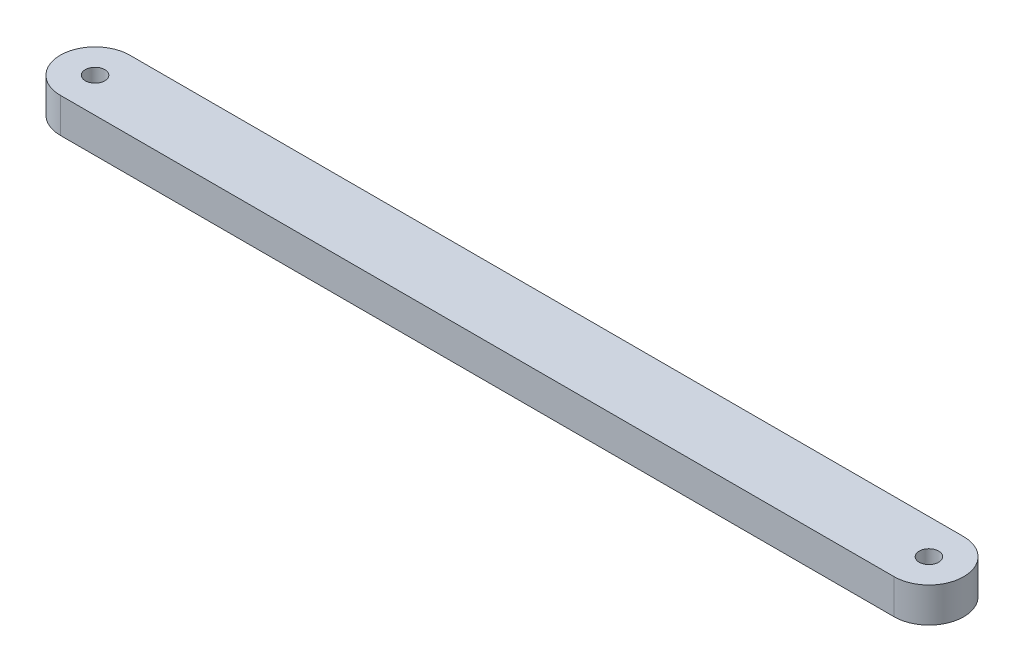
ISO-10303-21;
HEADER;
FILE_DESCRIPTION(('STEP AP214'),'2;1');
FILE_NAME('part.step','',(''),(''),'','','');
FILE_SCHEMA(('AUTOMOTIVE_DESIGN { 1 0 10303 214 1 1 1 1 }'));
ENDSEC;
DATA;
#1=APPLICATION_CONTEXT('core data for automotive mechanical design processes');
#2=APPLICATION_PROTOCOL_DEFINITION('international standard','automotive_design',2000,#1);
#3=PRODUCT_CONTEXT('',#1,'mechanical');
#4=PRODUCT('Part','Part','',(#3));
#5=PRODUCT_RELATED_PRODUCT_CATEGORY('part','',(#4));
#6=PRODUCT_DEFINITION_FORMATION('','',#4);
#7=PRODUCT_DEFINITION_CONTEXT('part definition',#1,'design');
#8=PRODUCT_DEFINITION('design','',#6,#7);
#9=PRODUCT_DEFINITION_SHAPE('','',#8);
#10=(LENGTH_UNIT() NAMED_UNIT(*) SI_UNIT(.MILLI.,.METRE.));
#11=(NAMED_UNIT(*) PLANE_ANGLE_UNIT() SI_UNIT($,.RADIAN.));
#12=(NAMED_UNIT(*) SI_UNIT($,.STERADIAN.) SOLID_ANGLE_UNIT());
#13=UNCERTAINTY_MEASURE_WITH_UNIT(LENGTH_MEASURE(1.E-05),#10,'distance_accuracy_value','');
#14=(GEOMETRIC_REPRESENTATION_CONTEXT(3) GLOBAL_UNCERTAINTY_ASSIGNED_CONTEXT((#13)) GLOBAL_UNIT_ASSIGNED_CONTEXT((#10,
#11,#12)) REPRESENTATION_CONTEXT('',''));
#15=CARTESIAN_POINT('',(0.,0.,0.));
#16=DIRECTION('',(0.,0.,1.));
#17=DIRECTION('',(1.,0.,0.));
#18=AXIS2_PLACEMENT_3D('',#15,#16,#17);
#19=CARTESIAN_POINT('',(0.,5.,0.));
#20=DIRECTION('',(0.,1.,0.));
#21=DIRECTION('',(0.,0.,1.));
#22=AXIS2_PLACEMENT_3D('',#19,#20,#21);
#23=PLANE('',#22);
#24=CARTESIAN_POINT('',(0.,5.,0.));
#25=DIRECTION('',(0.,1.,0.));
#26=DIRECTION('',(0.,0.,1.));
#27=AXIS2_PLACEMENT_3D('',#24,#25,#26);
#28=CIRCLE('',#27,1.4);
#29=CARTESIAN_POINT('',(0.,5.,1.4));
#30=VERTEX_POINT('',#29);
#31=EDGE_CURVE('E110',#30,#30,#28,.T.);
#32=ORIENTED_EDGE('',*,*,#31,.F.);
#33=EDGE_LOOP('',(#32));
#34=FACE_BOUND('',#33,.T.);
#35=CARTESIAN_POINT('',(0.,5.,0.));
#36=DIRECTION('',(0.,1.,0.));
#37=DIRECTION('',(0.,0.,1.));
#38=AXIS2_PLACEMENT_3D('',#35,#36,#37);
#39=CIRCLE('',#38,5.);
#40=CARTESIAN_POINT('',(0.,5.,-5.));
#41=VERTEX_POINT('',#40);
#42=CARTESIAN_POINT('',(0.,5.,5.));
#43=VERTEX_POINT('',#42);
#44=EDGE_CURVE('E95',#41,#43,#39,.T.);
#45=ORIENTED_EDGE('',*,*,#44,.T.);
#46=DIRECTION('',(1.,0.,0.));
#47=VECTOR('',#46,1.);
#48=CARTESIAN_POINT('',(0.,5.,5.));
#49=LINE('',#48,#47);
#50=CARTESIAN_POINT('',(120.,5.,5.));
#51=VERTEX_POINT('',#50);
#52=EDGE_CURVE('E90',#43,#51,#49,.T.);
#53=ORIENTED_EDGE('',*,*,#52,.T.);
#54=CARTESIAN_POINT('',(120.,5.,0.));
#55=DIRECTION('',(0.,1.,0.));
#56=DIRECTION('',(0.,0.,1.));
#57=AXIS2_PLACEMENT_3D('',#54,#55,#56);
#58=CIRCLE('',#57,5.);
#59=CARTESIAN_POINT('',(120.,5.,-5.));
#60=VERTEX_POINT('',#59);
#61=EDGE_CURVE('E93',#51,#60,#58,.T.);
#62=ORIENTED_EDGE('',*,*,#61,.T.);
#63=DIRECTION('',(-1.,0.,0.));
#64=VECTOR('',#63,1.);
#65=CARTESIAN_POINT('',(0.,5.,-5.));
#66=LINE('',#65,#64);
#67=EDGE_CURVE('E60',#60,#41,#66,.T.);
#68=ORIENTED_EDGE('',*,*,#67,.T.);
#69=EDGE_LOOP('',(#45,#53,#62,#68));
#70=FACE_BOUND('',#69,.T.);
#71=CARTESIAN_POINT('',(120.,5.,0.));
#72=DIRECTION('',(0.,1.,0.));
#73=DIRECTION('',(0.,0.,1.));
#74=AXIS2_PLACEMENT_3D('',#71,#72,#73);
#75=CIRCLE('',#74,1.4);
#76=CARTESIAN_POINT('',(120.,5.,1.4));
#77=VERTEX_POINT('',#76);
#78=EDGE_CURVE('E125',#77,#77,#75,.T.);
#79=ORIENTED_EDGE('',*,*,#78,.F.);
#80=EDGE_LOOP('',(#79));
#81=FACE_BOUND('',#80,.T.);
#82=ADVANCED_FACE('F43',(#34,#70,#81),#23,.T.);
#83=CARTESIAN_POINT('',(0.,0.,0.));
#84=DIRECTION('',(0.,1.,0.));
#85=DIRECTION('',(0.,0.,1.));
#86=AXIS2_PLACEMENT_3D('',#83,#84,#85);
#87=PLANE('',#86);
#88=CARTESIAN_POINT('',(0.,0.,0.));
#89=DIRECTION('',(0.,1.,0.));
#90=DIRECTION('',(0.,0.,1.));
#91=AXIS2_PLACEMENT_3D('',#88,#89,#90);
#92=CIRCLE('',#91,5.);
#93=CARTESIAN_POINT('',(0.,0.,-5.));
#94=VERTEX_POINT('',#93);
#95=CARTESIAN_POINT('',(0.,0.,5.));
#96=VERTEX_POINT('',#95);
#97=EDGE_CURVE('E107',#94,#96,#92,.T.);
#98=ORIENTED_EDGE('',*,*,#97,.F.);
#99=DIRECTION('',(-1.,0.,0.));
#100=VECTOR('',#99,1.);
#101=CARTESIAN_POINT('',(0.,0.,-5.));
#102=LINE('',#101,#100);
#103=CARTESIAN_POINT('',(120.,0.,-5.));
#104=VERTEX_POINT('',#103);
#105=EDGE_CURVE('E83',#104,#94,#102,.T.);
#106=ORIENTED_EDGE('',*,*,#105,.F.);
#107=CARTESIAN_POINT('',(120.,0.,0.));
#108=DIRECTION('',(0.,1.,0.));
#109=DIRECTION('',(0.,0.,1.));
#110=AXIS2_PLACEMENT_3D('',#107,#108,#109);
#111=CIRCLE('',#110,5.);
#112=CARTESIAN_POINT('',(120.,0.,5.));
#113=VERTEX_POINT('',#112);
#114=EDGE_CURVE('E77',#113,#104,#111,.T.);
#115=ORIENTED_EDGE('',*,*,#114,.F.);
#116=DIRECTION('',(1.,0.,0.));
#117=VECTOR('',#116,1.);
#118=CARTESIAN_POINT('',(0.,0.,5.));
#119=LINE('',#118,#117);
#120=EDGE_CURVE('E99',#96,#113,#119,.T.);
#121=ORIENTED_EDGE('',*,*,#120,.F.);
#122=EDGE_LOOP('',(#98,#106,#115,#121));
#123=FACE_BOUND('',#122,.T.);
#124=CARTESIAN_POINT('',(0.,0.,0.));
#125=DIRECTION('',(0.,1.,0.));
#126=DIRECTION('',(0.,0.,1.));
#127=AXIS2_PLACEMENT_3D('',#124,#125,#126);
#128=CIRCLE('',#127,1.4);
#129=CARTESIAN_POINT('',(0.,0.,1.4));
#130=VERTEX_POINT('',#129);
#131=EDGE_CURVE('E122',#130,#130,#128,.T.);
#132=ORIENTED_EDGE('',*,*,#131,.T.);
#133=EDGE_LOOP('',(#132));
#134=FACE_BOUND('',#133,.T.);
#135=CARTESIAN_POINT('',(120.,0.,0.));
#136=DIRECTION('',(0.,1.,0.));
#137=DIRECTION('',(0.,0.,1.));
#138=AXIS2_PLACEMENT_3D('',#135,#136,#137);
#139=CIRCLE('',#138,1.4);
#140=CARTESIAN_POINT('',(120.,0.,1.4));
#141=VERTEX_POINT('',#140);
#142=EDGE_CURVE('E128',#141,#141,#139,.T.);
#143=ORIENTED_EDGE('',*,*,#142,.T.);
#144=EDGE_LOOP('',(#143));
#145=FACE_BOUND('',#144,.T.);
#146=ADVANCED_FACE('F118',(#123,#134,#145),#87,.F.);
#147=CARTESIAN_POINT('',(0.,5.,0.));
#148=DIRECTION('',(0.,-1.,0.));
#149=DIRECTION('',(0.,0.,-1.));
#150=AXIS2_PLACEMENT_3D('',#147,#148,#149);
#151=CYLINDRICAL_SURFACE('',#150,5.);
#152=ORIENTED_EDGE('',*,*,#97,.T.);
#153=DIRECTION('',(0.,-1.,0.));
#154=VECTOR('',#153,1.);
#155=CARTESIAN_POINT('',(0.,5.,5.));
#156=LINE('',#155,#154);
#157=EDGE_CURVE('E11',#43,#96,#156,.T.);
#158=ORIENTED_EDGE('',*,*,#157,.F.);
#159=ORIENTED_EDGE('',*,*,#44,.F.);
#160=DIRECTION('',(0.,-1.,0.));
#161=VECTOR('',#160,1.);
#162=CARTESIAN_POINT('',(0.,5.,-5.));
#163=LINE('',#162,#161);
#164=EDGE_CURVE('E103',#41,#94,#163,.T.);
#165=ORIENTED_EDGE('',*,*,#164,.T.);
#166=EDGE_LOOP('',(#152,#158,#159,#165));
#167=FACE_BOUND('',#166,.T.);
#168=ADVANCED_FACE('F45',(#167),#151,.T.);
#169=CARTESIAN_POINT('',(0.,5.,5.));
#170=DIRECTION('',(0.,0.,-1.));
#171=DIRECTION('',(-1.,0.,0.));
#172=AXIS2_PLACEMENT_3D('',#169,#170,#171);
#173=PLANE('',#172);
#174=ORIENTED_EDGE('',*,*,#120,.T.);
#175=DIRECTION('',(0.,-1.,0.));
#176=VECTOR('',#175,1.);
#177=CARTESIAN_POINT('',(120.,5.,5.));
#178=LINE('',#177,#176);
#179=EDGE_CURVE('E52',#51,#113,#178,.T.);
#180=ORIENTED_EDGE('',*,*,#179,.F.);
#181=ORIENTED_EDGE('',*,*,#52,.F.);
#182=ORIENTED_EDGE('',*,*,#157,.T.);
#183=EDGE_LOOP('',(#174,#180,#181,#182));
#184=FACE_BOUND('',#183,.T.);
#185=ADVANCED_FACE('F98',(#184),#173,.F.);
#186=CARTESIAN_POINT('',(120.,5.,0.));
#187=DIRECTION('',(0.,-1.,0.));
#188=DIRECTION('',(0.,0.,-1.));
#189=AXIS2_PLACEMENT_3D('',#186,#187,#188);
#190=CYLINDRICAL_SURFACE('',#189,5.);
#191=ORIENTED_EDGE('',*,*,#114,.T.);
#192=DIRECTION('',(0.,-1.,0.));
#193=VECTOR('',#192,1.);
#194=CARTESIAN_POINT('',(120.,5.,-5.));
#195=LINE('',#194,#193);
#196=EDGE_CURVE('E100',#60,#104,#195,.T.);
#197=ORIENTED_EDGE('',*,*,#196,.F.);
#198=ORIENTED_EDGE('',*,*,#61,.F.);
#199=ORIENTED_EDGE('',*,*,#179,.T.);
#200=EDGE_LOOP('',(#191,#197,#198,#199));
#201=FACE_BOUND('',#200,.T.);
#202=ADVANCED_FACE('F101',(#201),#190,.T.);
#203=CARTESIAN_POINT('',(0.,5.,-5.));
#204=DIRECTION('',(0.,0.,1.));
#205=DIRECTION('',(1.,0.,0.));
#206=AXIS2_PLACEMENT_3D('',#203,#204,#205);
#207=PLANE('',#206);
#208=ORIENTED_EDGE('',*,*,#105,.T.);
#209=ORIENTED_EDGE('',*,*,#164,.F.);
#210=ORIENTED_EDGE('',*,*,#67,.F.);
#211=ORIENTED_EDGE('',*,*,#196,.T.);
#212=EDGE_LOOP('',(#208,#209,#210,#211));
#213=FACE_BOUND('',#212,.T.);
#214=ADVANCED_FACE('F115',(#213),#207,.F.);
#215=CARTESIAN_POINT('',(0.,5.,0.));
#216=DIRECTION('',(0.,-1.,0.));
#217=DIRECTION('',(0.,0.,-1.));
#218=AXIS2_PLACEMENT_3D('',#215,#216,#217);
#219=CYLINDRICAL_SURFACE('',#218,1.4);
#220=ORIENTED_EDGE('',*,*,#31,.T.);
#221=EDGE_LOOP('',(#220));
#222=FACE_BOUND('',#221,.T.);
#223=ORIENTED_EDGE('',*,*,#131,.F.);
#224=EDGE_LOOP('',(#223));
#225=FACE_BOUND('',#224,.T.);
#226=ADVANCED_FACE('F145',(#222,#225),#219,.F.);
#227=CARTESIAN_POINT('',(120.,5.,0.));
#228=DIRECTION('',(0.,-1.,0.));
#229=DIRECTION('',(0.,0.,-1.));
#230=AXIS2_PLACEMENT_3D('',#227,#228,#229);
#231=CYLINDRICAL_SURFACE('',#230,1.4);
#232=ORIENTED_EDGE('',*,*,#78,.T.);
#233=EDGE_LOOP('',(#232));
#234=FACE_BOUND('',#233,.T.);
#235=ORIENTED_EDGE('',*,*,#142,.F.);
#236=EDGE_LOOP('',(#235));
#237=FACE_BOUND('',#236,.T.);
#238=ADVANCED_FACE('F134',(#234,#237),#231,.F.);
#239=CLOSED_SHELL('',(#82,#146,#168,#185,#202,#214,#226,#238));
#240=MANIFOLD_SOLID_BREP('B2',#239);
#241=ADVANCED_BREP_SHAPE_REPRESENTATION('',(#18,#240),#14);
#242=SHAPE_DEFINITION_REPRESENTATION(#9,#241);
ENDSEC;
END-ISO-10303-21;
